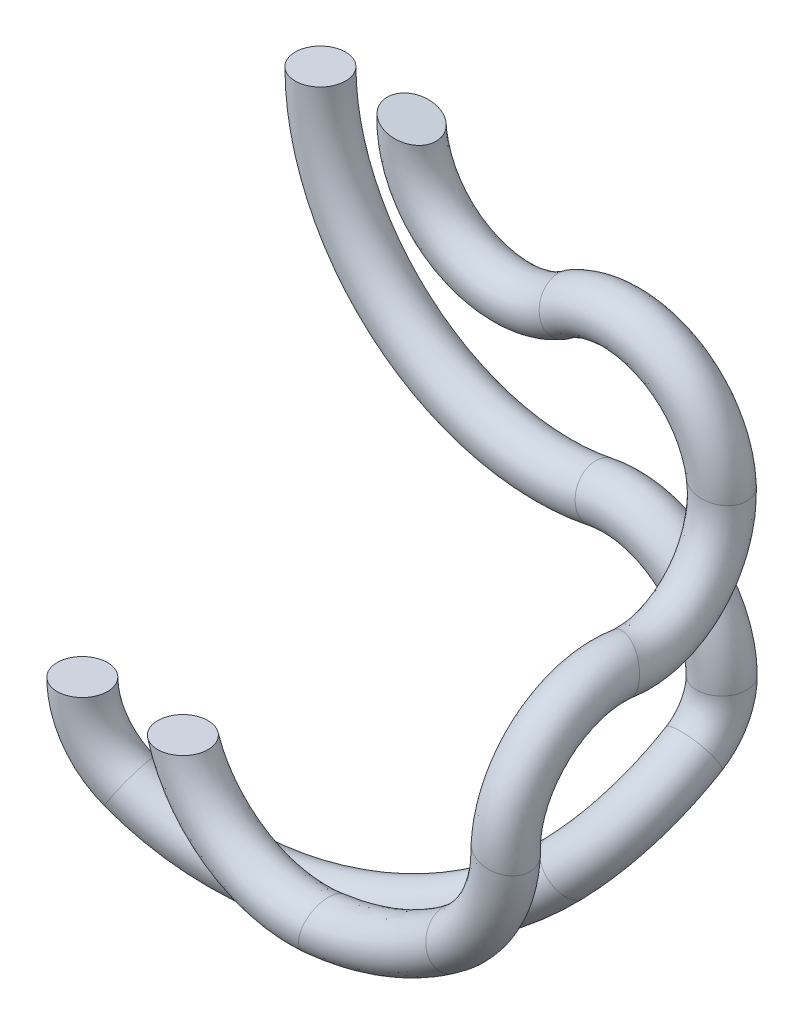
ISO-10303-21;
HEADER;
FILE_DESCRIPTION(('STEP AP214'),'2;1');
FILE_NAME('part.step','',(''),(''),'','','');
FILE_SCHEMA(('AUTOMOTIVE_DESIGN { 1 0 10303 214 1 1 1 1 }'));
ENDSEC;
DATA;
#1=APPLICATION_CONTEXT('core data for automotive mechanical design processes');
#2=APPLICATION_PROTOCOL_DEFINITION('international standard','automotive_design',2000,#1);
#3=PRODUCT_CONTEXT('',#1,'mechanical');
#4=PRODUCT('Part','Part','',(#3));
#5=PRODUCT_RELATED_PRODUCT_CATEGORY('part','',(#4));
#6=PRODUCT_DEFINITION_FORMATION('','',#4);
#7=PRODUCT_DEFINITION_CONTEXT('part definition',#1,'design');
#8=PRODUCT_DEFINITION('design','',#6,#7);
#9=PRODUCT_DEFINITION_SHAPE('','',#8);
#10=(LENGTH_UNIT() NAMED_UNIT(*) SI_UNIT(.MILLI.,.METRE.));
#11=(NAMED_UNIT(*) PLANE_ANGLE_UNIT() SI_UNIT($,.RADIAN.));
#12=(NAMED_UNIT(*) SI_UNIT($,.STERADIAN.) SOLID_ANGLE_UNIT());
#13=UNCERTAINTY_MEASURE_WITH_UNIT(LENGTH_MEASURE(1.E-05),#10,'distance_accuracy_value','');
#14=(GEOMETRIC_REPRESENTATION_CONTEXT(3) GLOBAL_UNCERTAINTY_ASSIGNED_CONTEXT((#13)) GLOBAL_UNIT_ASSIGNED_CONTEXT((#10,
#11,#12)) REPRESENTATION_CONTEXT('',''));
#15=CARTESIAN_POINT('',(0.,0.,0.));
#16=DIRECTION('',(0.,0.,1.));
#17=DIRECTION('',(1.,0.,0.));
#18=AXIS2_PLACEMENT_3D('',#15,#16,#17);
#19=CARTESIAN_POINT('',(16.9351419920652,50.,-27.3));
#20=DIRECTION('',(0.,0.,-1.));
#21=DIRECTION('',(-1.,0.,0.));
#22=AXIS2_PLACEMENT_3D('',#19,#20,#21);
#23=TOROIDAL_SURFACE('',#22,27.8251419920652,3.);
#24=CARTESIAN_POINT('',(22.5699196222703,22.751370531039,-27.3));
#25=DIRECTION('',(0.979280877586588,0.202506698144139,0.));
#26=DIRECTION('',(-0.172656624671145,0.834932041649049,0.522568823969549));
#27=AXIS2_PLACEMENT_3D('',#24,#25,#26);
#28=CIRCLE('',#27,3.);
#29=CARTESIAN_POINT('',(23.1774397167027,19.8135278982793,-27.3));
#30=VERTEX_POINT('',#29);
#31=EDGE_CURVE('E51',#30,#30,#28,.T.);
#32=CARTESIAN_POINT('',(-10.89,50.,-27.3));
#33=DIRECTION('',(0.,-1.,0.));
#34=DIRECTION('',(0.852597105446108,0.,0.522568823969549));
#35=AXIS2_PLACEMENT_3D('',#32,#33,#34);
#36=CIRCLE('',#35,3.);
#37=CARTESIAN_POINT('',(-13.89,50.,-27.3));
#38=VERTEX_POINT('',#37);
#39=EDGE_CURVE('E11',#38,#38,#36,.T.);
#40=CARTESIAN_POINT('',(16.9351419920652,50.,-27.3));
#41=DIRECTION('',(0.,0.,-1.));
#42=DIRECTION('',(-1.,0.,0.));
#43=AXIS2_PLACEMENT_3D('',#40,#41,#42);
#44=CIRCLE('',#43,30.8251419920652);
#45=EDGE_CURVE('',#30,#38,#44,.T.);
#46=ORIENTED_EDGE('',*,*,#31,.F.);
#47=ORIENTED_EDGE('',*,*,#39,.T.);
#48=ORIENTED_EDGE('',*,*,#45,.T.);
#49=ORIENTED_EDGE('',*,*,#45,.F.);
#50=EDGE_LOOP('',(#46,#48,#47,#49));
#51=FACE_BOUND('',#50,.T.);
#52=ADVANCED_FACE('F45',(#51),#23,.T.);
#53=CARTESIAN_POINT('',(25.,11.,-27.3));
#54=DIRECTION('',(0.,0.,1.));
#55=DIRECTION('',(1.,0.,0.));
#56=AXIS2_PLACEMENT_3D('',#53,#54,#55);
#57=TOROIDAL_SURFACE('',#56,12.,3.);
#58=CARTESIAN_POINT('',(37.,11.,-27.3));
#59=DIRECTION('',(0.,-1.,0.));
#60=DIRECTION('',(0.852597105446108,0.,0.522568823969549));
#61=AXIS2_PLACEMENT_3D('',#58,#59,#60);
#62=CIRCLE('',#61,3.);
#63=CARTESIAN_POINT('',(37.,11.,-30.3));
#64=VERTEX_POINT('',#63);
#65=EDGE_CURVE('E55',#64,#64,#62,.T.);
#66=ORIENTED_EDGE('',*,*,#65,.F.);
#67=EDGE_LOOP('',(#66));
#68=FACE_BOUND('',#67,.T.);
#69=ORIENTED_EDGE('',*,*,#31,.T.);
#70=EDGE_LOOP('',(#69));
#71=FACE_BOUND('',#70,.T.);
#72=ADVANCED_FACE('F92',(#68,#71),#57,.T.);
#73=CARTESIAN_POINT('',(37.,11.,-20.395348240824));
#74=DIRECTION('',(1.,0.,0.));
#75=DIRECTION('',(0.,0.,-1.));
#76=AXIS2_PLACEMENT_3D('',#73,#74,#75);
#77=TOROIDAL_SURFACE('',#76,6.904651759176,3.);
#78=CARTESIAN_POINT('',(37.,5.10238614193704,-23.9859424390976));
#79=DIRECTION('',(0.,-0.520025386291466,0.854150804959178));
#80=DIRECTION('',(0.852597105446108,0.446352581640159,0.271749054548646));
#81=AXIS2_PLACEMENT_3D('',#78,#79,#80);
#82=CIRCLE('',#81,3.);
#83=CARTESIAN_POINT('',(37.,2.53993372705951,-25.546018597972));
#84=VERTEX_POINT('',#83);
#85=EDGE_CURVE('E59',#84,#84,#82,.T.);
#86=CARTESIAN_POINT('',(37.,11.,-20.395348240824));
#87=DIRECTION('',(1.,0.,0.));
#88=DIRECTION('',(0.,0.,-1.));
#89=AXIS2_PLACEMENT_3D('',#86,#87,#88);
#90=CIRCLE('',#89,9.904651759176);
#91=EDGE_CURVE('',#84,#64,#90,.T.);
#92=ORIENTED_EDGE('',*,*,#85,.F.);
#93=ORIENTED_EDGE('',*,*,#65,.T.);
#94=ORIENTED_EDGE('',*,*,#91,.T.);
#95=ORIENTED_EDGE('',*,*,#91,.F.);
#96=EDGE_LOOP('',(#92,#94,#93,#95));
#97=FACE_BOUND('',#96,.T.);
#98=ADVANCED_FACE('F97',(#97),#77,.T.);
#99=CARTESIAN_POINT('',(21.7451166473611,-3.05860056901118,-28.9545267244958));
#100=DIRECTION('',(-0.530805740597417,0.72388727195638,0.440718144904855));
#101=DIRECTION('',(-0.806428862094083,-0.5913311173798,0.));
#102=AXIS2_PLACEMENT_3D('',#99,#100,#101);
#103=TOROIDAL_SURFACE('',#102,18.,3.);
#104=CARTESIAN_POINT('',(31.5831807698066,-4.94926837933397,-14.));
#105=DIRECTION('',(-0.647702397999498,-0.681875666821053,0.339892892869276));
#106=DIRECTION('',(0.55167683164338,-0.112046453323261,0.826497589667145));
#107=AXIS2_PLACEMENT_3D('',#104,#105,#106);
#108=CIRCLE('',#107,3.);
#109=CARTESIAN_POINT('',(33.6874625871225,-7.07280359381306,-14.2501923783424));
#110=VERTEX_POINT('',#109);
#111=EDGE_CURVE('E64',#110,#110,#108,.T.);
#112=ORIENTED_EDGE('',*,*,#111,.F.);
#113=EDGE_LOOP('',(#112));
#114=FACE_BOUND('',#113,.T.);
#115=ORIENTED_EDGE('',*,*,#85,.T.);
#116=EDGE_LOOP('',(#115));
#117=FACE_BOUND('',#116,.T.);
#118=ADVANCED_FACE('F88',(#114,#117),#103,.T.);
#119=CARTESIAN_POINT('',(8.36480483374628,18.4815470739529,-11.2394093562524));
#120=DIRECTION('',(0.297458207324946,0.184393410295391,0.936759139338744));
#121=DIRECTION('',(0.953102447319214,0.,-0.302647856285362));
#122=AXIS2_PLACEMENT_3D('',#119,#120,#121);
#123=TOROIDAL_SURFACE('',#122,33.101615589221,3.);
#124=CARTESIAN_POINT('',(-7.21066117438773,-8.84124245078046,-0.91531201880252));
#125=DIRECTION('',(-0.830731909192709,0.533552435566831,0.158764900244794));
#126=DIRECTION('',(0.0860036250696564,-0.158764900244794,0.983563461564702));
#127=AXIS2_PLACEMENT_3D('',#124,#125,#126);
#128=CIRCLE('',#127,3.);
#129=CARTESIAN_POINT('',(-8.6222659312147,-11.3175073434491,0.020361103521915));
#130=VERTEX_POINT('',#129);
#131=EDGE_CURVE('E67',#130,#130,#128,.T.);
#132=CARTESIAN_POINT('',(8.36480483374628,18.4815470739529,-11.2394093562524));
#133=DIRECTION('',(0.297458207324946,0.184393410295391,0.936759139338744));
#134=DIRECTION('',(0.953102447319214,0.,-0.302647856285362));
#135=AXIS2_PLACEMENT_3D('',#132,#133,#134);
#136=CIRCLE('',#135,36.101615589221);
#137=EDGE_CURVE('',#130,#110,#136,.T.);
#138=ORIENTED_EDGE('',*,*,#131,.F.);
#139=ORIENTED_EDGE('',*,*,#111,.T.);
#140=ORIENTED_EDGE('',*,*,#137,.T.);
#141=ORIENTED_EDGE('',*,*,#137,.F.);
#142=EDGE_LOOP('',(#138,#140,#139,#141));
#143=FACE_BOUND('',#142,.T.);
#144=ADVANCED_FACE('F79',(#143),#123,.T.);
#145=CARTESIAN_POINT('',(-1.73231035854521,0.,-1.96230420865165));
#146=DIRECTION('',(-0.187717069170102,0.,-0.982223142642336));
#147=DIRECTION('',(-0.982223142642336,0.,0.187717069170102));
#148=AXIS2_PLACEMENT_3D('',#145,#146,#147);
#149=TOROIDAL_SURFACE('',#148,10.4535203821741,3.);
#150=ORIENTED_EDGE('',*,*,#131,.T.);
#151=EDGE_LOOP('',(#150));
#152=FACE_BOUND('',#151,.T.);
#153=CARTESIAN_POINT('',(-12.,0.,0.));
#154=DIRECTION('',(0.,1.,0.));
#155=DIRECTION('',(0.,0.,1.));
#156=AXIS2_PLACEMENT_3D('',#153,#154,#155);
#157=CIRCLE('',#156,3.);
#158=CARTESIAN_POINT('',(-12.,0.,3.));
#159=VERTEX_POINT('',#158);
#160=EDGE_CURVE('E70',#159,#159,#157,.T.);
#161=ORIENTED_EDGE('',*,*,#160,.F.);
#162=EDGE_LOOP('',(#161));
#163=FACE_BOUND('',#162,.T.);
#164=ADVANCED_FACE('F76',(#152,#163),#149,.T.);
#165=CARTESIAN_POINT('',(-10.89,50.,-27.3));
#166=DIRECTION('',(0.,-1.,0.));
#167=DIRECTION('',(0.852597105446108,0.,0.52256882396955));
#168=AXIS2_PLACEMENT_3D('',#165,#166,#167);
#169=PLANE('',#168);
#170=ORIENTED_EDGE('',*,*,#39,.F.);
#171=EDGE_LOOP('',(#170));
#172=FACE_BOUND('',#171,.T.);
#173=ADVANCED_FACE('F78',(#172),#169,.F.);
#174=CARTESIAN_POINT('',(-12.,0.,0.));
#175=DIRECTION('',(0.,1.,0.));
#176=DIRECTION('',(0.,0.,1.));
#177=AXIS2_PLACEMENT_3D('',#174,#175,#176);
#178=PLANE('',#177);
#179=ORIENTED_EDGE('',*,*,#160,.T.);
#180=EDGE_LOOP('',(#179));
#181=FACE_BOUND('',#180,.T.);
#182=ADVANCED_FACE('F74',(#181),#178,.T.);
#183=CLOSED_SHELL('',(#52,#72,#98,#118,#144,#164,#173,#182));
#184=MANIFOLD_SOLID_BREP('B2',#183);
#185=CARTESIAN_POINT('',(18.4267947993216,40.039570378745,-27.3));
#186=DIRECTION('',(0.959537224257936,0.279553632518246,0.0337354681193033));
#187=DIRECTION('',(-0.0629262915984508,0.0961103318531538,0.9933796283077));
#188=AXIS2_PLACEMENT_3D('',#185,#186,#187);
#189=CIRCLE('',#188,3.);
#190=CARTESIAN_POINT('',(11.9054054054054,50.,-27.3));
#191=DIRECTION('',(0.,0.,-1.));
#192=AXIS1_PLACEMENT('',#190,#191);
#193=SURFACE_OF_REVOLUTION('',#189,#192);
#194=CARTESIAN_POINT('',(18.2380159245263,40.3279013743045,-24.3198611150769));
#195=VERTEX_POINT('',#194);
#196=EDGE_CURVE('E168',#195,#195,#189,.T.);
#197=ORIENTED_EDGE('',*,*,#196,.F.);
#198=EDGE_LOOP('',(#197));
#199=FACE_BOUND('',#198,.T.);
#200=CARTESIAN_POINT('',(0.,50.,-27.3));
#201=DIRECTION('',(-0.291719725369664,-0.955908740425057,0.0337354681193033));
#202=DIRECTION('',(0.114877822329885,0.,0.9933796283077));
#203=AXIS2_PLACEMENT_3D('',#200,#201,#202);
#204=CIRCLE('',#203,3.);
#205=CARTESIAN_POINT('',(0.344633466989637,50.,-24.3198611150769));
#206=VERTEX_POINT('',#205);
#207=EDGE_CURVE('E44',#206,#206,#204,.T.);
#208=ORIENTED_EDGE('',*,*,#207,.T.);
#209=EDGE_LOOP('',(#208));
#210=FACE_BOUND('',#209,.T.);
#211=ADVANCED_FACE('F162',(#199,#210),#193,.T.);
#212=CARTESIAN_POINT('',(36.9545798429168,31.0430823454196,-27.3));
#213=DIRECTION('',(-0.207524601476317,-0.977647921274764,0.0337354681193033));
#214=DIRECTION('',(0.114443008268585,0.00998558569604638,0.9933796283077));
#215=AXIS2_PLACEMENT_3D('',#212,#213,#214);
#216=CIRCLE('',#215,3.);
#217=CARTESIAN_POINT('',(25.,30.,-27.3));
#218=DIRECTION('',(0.,0.,1.));
#219=AXIS1_PLACEMENT('',#217,#218);
#220=SURFACE_OF_REVOLUTION('',#216,#219);
#221=CARTESIAN_POINT('',(37.2979088677226,31.0730391025077,-24.3198611150769));
#222=VERTEX_POINT('',#221);
#223=EDGE_CURVE('E172',#222,#222,#216,.T.);
#224=ORIENTED_EDGE('',*,*,#223,.F.);
#225=EDGE_LOOP('',(#224));
#226=FACE_BOUND('',#225,.T.);
#227=ORIENTED_EDGE('',*,*,#196,.T.);
#228=EDGE_LOOP('',(#227));
#229=FACE_BOUND('',#228,.T.);
#230=ADVANCED_FACE('F183',(#226,#229),#220,.T.);
#231=CARTESIAN_POINT('',(38.4121691631828,19.5675307160615,-13.9692636911985));
#232=DIRECTION('',(-0.273277202466597,0.136256644713016,0.952236156309758));
#233=DIRECTION('',(-0.00996717827159849,0.989462794406293,-0.144443877831469));
#234=AXIS2_PLACEMENT_3D('',#231,#232,#233);
#235=CIRCLE('',#234,3.);
#236=CARTESIAN_POINT('',(37.3510452517562,31.0776754531627,-15.6292431247677));
#237=DIRECTION('',(0.995636290290767,0.0868730353143006,-0.0340800996377643));
#238=AXIS1_PLACEMENT('',#236,#237);
#239=SURFACE_OF_REVOLUTION('',#235,#238);
#240=CARTESIAN_POINT('',(38.382267628368,22.5359190992804,-14.4025953246929));
#241=VERTEX_POINT('',#240);
#242=EDGE_CURVE('E176',#241,#241,#235,.T.);
#243=ORIENTED_EDGE('',*,*,#242,.F.);
#244=EDGE_LOOP('',(#243));
#245=FACE_BOUND('',#244,.T.);
#246=ORIENTED_EDGE('',*,*,#223,.T.);
#247=EDGE_LOOP('',(#246));
#248=FACE_BOUND('',#247,.T.);
#249=ADVANCED_FACE('F186',(#245,#248),#239,.T.);
#250=CARTESIAN_POINT('',(38.5338301237857,7.48999073753314,0.));
#251=DIRECTION('',(-0.305710549113246,-0.952124498246357,0.));
#252=DIRECTION('',(0.,0.,1.));
#253=AXIS2_PLACEMENT_3D('',#250,#251,#252);
#254=CIRCLE('',#253,3.);
#255=CARTESIAN_POINT('',(38.2943910551753,7.49301432841303,-12.2014593280839));
#256=DIRECTION('',(-0.999727772129409,0.0126243715853622,0.0196215920669764));
#257=AXIS1_PLACEMENT('',#255,#256);
#258=SURFACE_OF_REVOLUTION('',#254,#257);
#259=CARTESIAN_POINT('',(38.5338301237857,7.48999073753314,3.));
#260=VERTEX_POINT('',#259);
#261=EDGE_CURVE('E198',#260,#260,#254,.T.);
#262=ORIENTED_EDGE('',*,*,#261,.F.);
#263=EDGE_LOOP('',(#262));
#264=FACE_BOUND('',#263,.T.);
#265=ORIENTED_EDGE('',*,*,#242,.T.);
#266=EDGE_LOOP('',(#265));
#267=FACE_BOUND('',#266,.T.);
#268=ADVANCED_FACE('F190',(#264,#267),#258,.T.);
#269=CARTESIAN_POINT('',(32.1489300837781,-4.96187427452396,0.));
#270=DIRECTION('',(-0.943503040465269,-0.331363867421891,0.));
#271=DIRECTION('',(0.,0.,1.));
#272=AXIS2_PLACEMENT_3D('',#269,#270,#271);
#273=CIRCLE('',#272,3.);
#274=CARTESIAN_POINT('',(22.8123647182544,7.68851840344272,0.));
#275=DIRECTION('',(0.,0.,1.));
#276=AXIS1_PLACEMENT('',#274,#275);
#277=SURFACE_OF_REVOLUTION('',#273,#276);
#278=CARTESIAN_POINT('',(32.1489300837781,-4.96187427452396,3.));
#279=VERTEX_POINT('',#278);
#280=EDGE_CURVE('E201',#279,#279,#273,.T.);
#281=ORIENTED_EDGE('',*,*,#280,.F.);
#282=EDGE_LOOP('',(#281));
#283=FACE_BOUND('',#282,.T.);
#284=ORIENTED_EDGE('',*,*,#261,.T.);
#285=EDGE_LOOP('',(#284));
#286=FACE_BOUND('',#285,.T.);
#287=ADVANCED_FACE('F194',(#283,#286),#277,.T.);
#288=CARTESIAN_POINT('',(16.8480319477906,-11.,0.));
#289=DIRECTION('',(-0.983459342715245,0.181129018177921,0.));
#290=DIRECTION('',(0.,0.,1.));
#291=AXIS2_PLACEMENT_3D('',#288,#289,#290);
#292=CIRCLE('',#291,3.);
#293=CARTESIAN_POINT('',(13.1468686667766,20.7845891416218,0.));
#294=DIRECTION('',(0.,0.,1.));
#295=AXIS1_PLACEMENT('',#293,#294);
#296=SURFACE_OF_REVOLUTION('',#292,#295);
#297=CARTESIAN_POINT('',(16.8480319477906,-11.,3.));
#298=VERTEX_POINT('',#297);
#299=EDGE_CURVE('E205',#298,#298,#292,.T.);
#300=ORIENTED_EDGE('',*,*,#299,.F.);
#301=EDGE_LOOP('',(#300));
#302=FACE_BOUND('',#301,.T.);
#303=ORIENTED_EDGE('',*,*,#280,.T.);
#304=EDGE_LOOP('',(#303));
#305=FACE_BOUND('',#304,.T.);
#306=ADVANCED_FACE('F214',(#302,#305),#296,.T.);
#307=CARTESIAN_POINT('',(15.0294843626983,4.6171947676977,0.));
#308=DIRECTION('',(0.,0.,-1.));
#309=AXIS1_PLACEMENT('',#307,#308);
#310=SURFACE_OF_REVOLUTION('',#292,#309);
#311=ORIENTED_EDGE('',*,*,#299,.T.);
#312=EDGE_LOOP('',(#311));
#313=FACE_BOUND('',#312,.T.);
#314=CARTESIAN_POINT('',(0.,0.,0.));
#315=DIRECTION('',(0.,1.,0.));
#316=DIRECTION('',(0.,0.,1.));
#317=AXIS2_PLACEMENT_3D('',#314,#315,#316);
#318=CIRCLE('',#317,3.);
#319=CARTESIAN_POINT('',(0.,0.,3.));
#320=VERTEX_POINT('',#319);
#321=EDGE_CURVE('E209',#320,#320,#318,.T.);
#322=ORIENTED_EDGE('',*,*,#321,.F.);
#323=EDGE_LOOP('',(#322));
#324=FACE_BOUND('',#323,.T.);
#325=ADVANCED_FACE('F212',(#313,#324),#310,.F.);
#326=CARTESIAN_POINT('',(0.,50.,-27.3));
#327=DIRECTION('',(-0.291719725369664,-0.955908740425057,0.0337354681193033));
#328=DIRECTION('',(0.114877822329885,0.,0.9933796283077));
#329=AXIS2_PLACEMENT_3D('',#326,#327,#328);
#330=PLANE('',#329);
#331=ORIENTED_EDGE('',*,*,#207,.F.);
#332=EDGE_LOOP('',(#331));
#333=FACE_BOUND('',#332,.T.);
#334=ADVANCED_FACE('F221',(#333),#330,.F.);
#335=CARTESIAN_POINT('',(0.,0.,0.));
#336=DIRECTION('',(0.,1.,0.));
#337=DIRECTION('',(0.,0.,1.));
#338=AXIS2_PLACEMENT_3D('',#335,#336,#337);
#339=PLANE('',#338);
#340=ORIENTED_EDGE('',*,*,#321,.T.);
#341=EDGE_LOOP('',(#340));
#342=FACE_BOUND('',#341,.T.);
#343=ADVANCED_FACE('F264',(#342),#339,.T.);
#344=CLOSED_SHELL('',(#211,#230,#249,#268,#287,#306,#325,#334,#343));
#345=MANIFOLD_SOLID_BREP('B6',#344);
#346=ADVANCED_BREP_SHAPE_REPRESENTATION('',(#18,#184,#345),#14);
#347=SHAPE_DEFINITION_REPRESENTATION(#9,#346);
ENDSEC;
END-ISO-10303-21;
